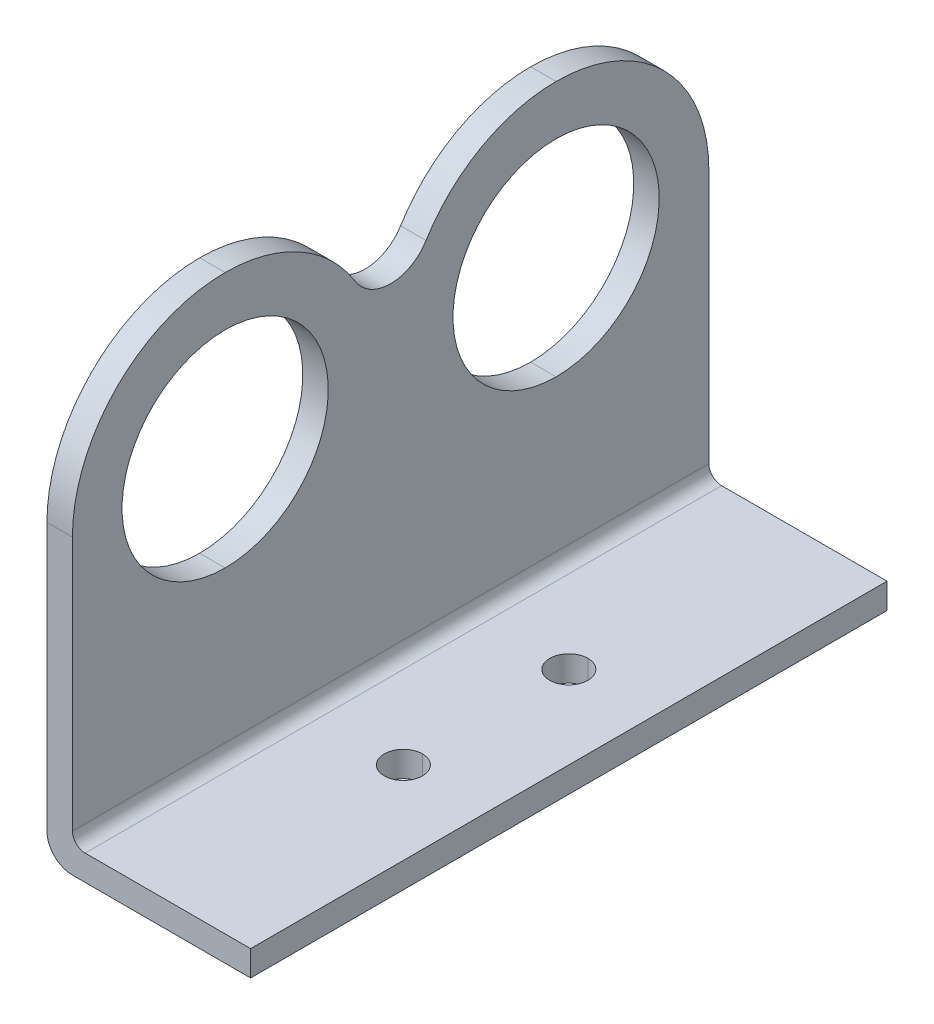
ISO-10303-21;
HEADER;
FILE_DESCRIPTION(('STEP AP214'),'2;1');
FILE_NAME('part.step','',(''),(''),'','','');
FILE_SCHEMA(('AUTOMOTIVE_DESIGN { 1 0 10303 214 1 1 1 1 }'));
ENDSEC;
DATA;
#1=APPLICATION_CONTEXT('core data for automotive mechanical design processes');
#2=APPLICATION_PROTOCOL_DEFINITION('international standard','automotive_design',2000,#1);
#3=PRODUCT_CONTEXT('',#1,'mechanical');
#4=PRODUCT('Part','Part','',(#3));
#5=PRODUCT_RELATED_PRODUCT_CATEGORY('part','',(#4));
#6=PRODUCT_DEFINITION_FORMATION('','',#4);
#7=PRODUCT_DEFINITION_CONTEXT('part definition',#1,'design');
#8=PRODUCT_DEFINITION('design','',#6,#7);
#9=PRODUCT_DEFINITION_SHAPE('','',#8);
#10=(LENGTH_UNIT() NAMED_UNIT(*) SI_UNIT(.MILLI.,.METRE.));
#11=(NAMED_UNIT(*) PLANE_ANGLE_UNIT() SI_UNIT($,.RADIAN.));
#12=(NAMED_UNIT(*) SI_UNIT($,.STERADIAN.) SOLID_ANGLE_UNIT());
#13=UNCERTAINTY_MEASURE_WITH_UNIT(LENGTH_MEASURE(1.E-05),#10,'distance_accuracy_value','');
#14=(GEOMETRIC_REPRESENTATION_CONTEXT(3) GLOBAL_UNCERTAINTY_ASSIGNED_CONTEXT((#13)) GLOBAL_UNIT_ASSIGNED_CONTEXT((#10,
#11,#12)) REPRESENTATION_CONTEXT('',''));
#15=CARTESIAN_POINT('',(0.,0.,0.));
#16=DIRECTION('',(0.,0.,1.));
#17=DIRECTION('',(1.,0.,0.));
#18=AXIS2_PLACEMENT_3D('',#15,#16,#17);
#19=CARTESIAN_POINT('',(-48.,31.,25.));
#20=DIRECTION('',(1.,0.,0.));
#21=DIRECTION('',(0.,1.,0.));
#22=AXIS2_PLACEMENT_3D('',#19,#20,#21);
#23=CYLINDRICAL_SURFACE('',#22,3.26433752247375);
#24=DIRECTION('',(1.,0.,0.));
#25=VECTOR('',#24,1.);
#26=CARTESIAN_POINT('',(-48.,29.289169107972,27.7801001995454));
#27=LINE('',#26,#25);
#28=CARTESIAN_POINT('',(0.,29.289169107972,27.7801001995454));
#29=VERTEX_POINT('',#28);
#30=CARTESIAN_POINT('',(2.,29.289169107972,27.7801001995454));
#31=VERTEX_POINT('',#30);
#32=EDGE_CURVE('E273',#29,#31,#27,.T.);
#33=ORIENTED_EDGE('',*,*,#32,.T.);
#34=CARTESIAN_POINT('',(2.,31.,25.));
#35=DIRECTION('',(1.,0.,0.));
#36=DIRECTION('',(0.,1.,0.));
#37=AXIS2_PLACEMENT_3D('',#34,#35,#36);
#38=CIRCLE('',#37,3.26433752247375);
#39=CARTESIAN_POINT('',(2.,29.289169107972,22.2198998004546));
#40=VERTEX_POINT('',#39);
#41=EDGE_CURVE('E342',#31,#40,#38,.T.);
#42=ORIENTED_EDGE('',*,*,#41,.T.);
#43=DIRECTION('',(1.,0.,0.));
#44=VECTOR('',#43,1.);
#45=CARTESIAN_POINT('',(-48.,29.289169107972,22.2198998004546));
#46=LINE('',#45,#44);
#47=CARTESIAN_POINT('',(0.,29.289169107972,22.2198998004546));
#48=VERTEX_POINT('',#47);
#49=EDGE_CURVE('E9',#48,#40,#46,.T.);
#50=ORIENTED_EDGE('',*,*,#49,.F.);
#51=CARTESIAN_POINT('',(0.,31.,25.));
#52=DIRECTION('',(1.,0.,0.));
#53=DIRECTION('',(0.,1.,0.));
#54=AXIS2_PLACEMENT_3D('',#51,#52,#53);
#55=CIRCLE('',#54,3.26433752247375);
#56=EDGE_CURVE('E285',#29,#48,#55,.T.);
#57=ORIENTED_EDGE('',*,*,#56,.F.);
#58=EDGE_LOOP('',(#33,#42,#50,#57));
#59=FACE_BOUND('',#58,.T.);
#60=ADVANCED_FACE('F15',(#59),#23,.F.);
#61=CARTESIAN_POINT('',(-48.,23.,38.));
#62=DIRECTION('',(1.,0.,0.));
#63=DIRECTION('',(0.,1.,0.));
#64=AXIS2_PLACEMENT_3D('',#61,#62,#63);
#65=CYLINDRICAL_SURFACE('',#64,8.1);
#66=DIRECTION('',(1.,0.,0.));
#67=VECTOR('',#66,1.);
#68=CARTESIAN_POINT('',(-48.,14.9,38.));
#69=LINE('',#68,#67);
#70=CARTESIAN_POINT('',(0.,14.9,38.));
#71=VERTEX_POINT('',#70);
#72=CARTESIAN_POINT('',(2.,14.9,38.));
#73=VERTEX_POINT('',#72);
#74=EDGE_CURVE('E213',#71,#73,#69,.T.);
#75=ORIENTED_EDGE('',*,*,#74,.F.);
#76=CARTESIAN_POINT('',(0.,23.,38.));
#77=DIRECTION('',(1.,0.,0.));
#78=DIRECTION('',(0.,1.,0.));
#79=AXIS2_PLACEMENT_3D('',#76,#77,#78);
#80=CIRCLE('',#79,8.1);
#81=CARTESIAN_POINT('',(0.,31.1,38.));
#82=VERTEX_POINT('',#81);
#83=EDGE_CURVE('E199',#82,#71,#80,.T.);
#84=ORIENTED_EDGE('',*,*,#83,.F.);
#85=DIRECTION('',(1.,0.,0.));
#86=VECTOR('',#85,1.);
#87=CARTESIAN_POINT('',(-48.,31.1,38.));
#88=LINE('',#87,#86);
#89=CARTESIAN_POINT('',(2.,31.1,38.));
#90=VERTEX_POINT('',#89);
#91=EDGE_CURVE('E223',#82,#90,#88,.T.);
#92=ORIENTED_EDGE('',*,*,#91,.T.);
#93=CARTESIAN_POINT('',(2.,23.,38.));
#94=DIRECTION('',(1.,0.,0.));
#95=DIRECTION('',(0.,1.,0.));
#96=AXIS2_PLACEMENT_3D('',#93,#94,#95);
#97=CIRCLE('',#96,8.1);
#98=EDGE_CURVE('E215',#90,#73,#97,.T.);
#99=ORIENTED_EDGE('',*,*,#98,.T.);
#100=EDGE_LOOP('',(#75,#84,#92,#99));
#101=FACE_BOUND('',#100,.T.);
#102=ADVANCED_FACE('F214',(#101),#65,.F.);
#103=CARTESIAN_POINT('',(-48.,23.,12.));
#104=DIRECTION('',(1.,0.,0.));
#105=DIRECTION('',(0.,1.,0.));
#106=AXIS2_PLACEMENT_3D('',#103,#104,#105);
#107=CYLINDRICAL_SURFACE('',#106,8.1);
#108=DIRECTION('',(1.,0.,0.));
#109=VECTOR('',#108,1.);
#110=CARTESIAN_POINT('',(-48.,14.9,12.));
#111=LINE('',#110,#109);
#112=CARTESIAN_POINT('',(0.,14.9,12.));
#113=VERTEX_POINT('',#112);
#114=CARTESIAN_POINT('',(2.,14.9,12.));
#115=VERTEX_POINT('',#114);
#116=EDGE_CURVE('E234',#113,#115,#111,.T.);
#117=ORIENTED_EDGE('',*,*,#116,.F.);
#118=CARTESIAN_POINT('',(0.,23.,12.));
#119=DIRECTION('',(1.,0.,0.));
#120=DIRECTION('',(0.,1.,0.));
#121=AXIS2_PLACEMENT_3D('',#118,#119,#120);
#122=CIRCLE('',#121,8.1);
#123=CARTESIAN_POINT('',(0.,31.1,12.));
#124=VERTEX_POINT('',#123);
#125=EDGE_CURVE('E209',#124,#113,#122,.T.);
#126=ORIENTED_EDGE('',*,*,#125,.F.);
#127=DIRECTION('',(1.,0.,0.));
#128=VECTOR('',#127,1.);
#129=CARTESIAN_POINT('',(-48.,31.1,12.));
#130=LINE('',#129,#128);
#131=CARTESIAN_POINT('',(2.,31.1,12.));
#132=VERTEX_POINT('',#131);
#133=EDGE_CURVE('E233',#124,#132,#130,.T.);
#134=ORIENTED_EDGE('',*,*,#133,.T.);
#135=CARTESIAN_POINT('',(2.,23.,12.));
#136=DIRECTION('',(1.,0.,0.));
#137=DIRECTION('',(0.,1.,0.));
#138=AXIS2_PLACEMENT_3D('',#135,#136,#137);
#139=CIRCLE('',#138,8.1);
#140=EDGE_CURVE('E308',#132,#115,#139,.T.);
#141=ORIENTED_EDGE('',*,*,#140,.T.);
#142=EDGE_LOOP('',(#117,#126,#134,#141));
#143=FACE_BOUND('',#142,.T.);
#144=ADVANCED_FACE('F473',(#143),#107,.F.);
#145=CARTESIAN_POINT('',(-48.,23.,38.));
#146=DIRECTION('',(1.,0.,0.));
#147=DIRECTION('',(0.,1.,0.));
#148=AXIS2_PLACEMENT_3D('',#145,#146,#147);
#149=CYLINDRICAL_SURFACE('',#148,12.);
#150=DIRECTION('',(1.,0.,0.));
#151=VECTOR('',#150,1.);
#152=CARTESIAN_POINT('',(-48.,35.,38.));
#153=LINE('',#152,#151);
#154=CARTESIAN_POINT('',(0.,35.,38.));
#155=VERTEX_POINT('',#154);
#156=CARTESIAN_POINT('',(2.,35.,38.));
#157=VERTEX_POINT('',#156);
#158=EDGE_CURVE('E265',#155,#157,#153,.T.);
#159=ORIENTED_EDGE('',*,*,#158,.F.);
#160=CARTESIAN_POINT('',(0.,23.,38.));
#161=DIRECTION('',(1.,0.,0.));
#162=DIRECTION('',(0.,1.,0.));
#163=AXIS2_PLACEMENT_3D('',#160,#161,#162);
#164=CIRCLE('',#163,12.);
#165=CARTESIAN_POINT('',(0.,23.,50.));
#166=VERTEX_POINT('',#165);
#167=EDGE_CURVE('E210',#155,#166,#164,.T.);
#168=ORIENTED_EDGE('',*,*,#167,.T.);
#169=DIRECTION('',(1.,0.,0.));
#170=VECTOR('',#169,1.);
#171=CARTESIAN_POINT('',(-48.,23.,50.));
#172=LINE('',#171,#170);
#173=CARTESIAN_POINT('',(2.,23.,50.));
#174=VERTEX_POINT('',#173);
#175=EDGE_CURVE('E23',#166,#174,#172,.T.);
#176=ORIENTED_EDGE('',*,*,#175,.T.);
#177=CARTESIAN_POINT('',(2.,23.,38.));
#178=DIRECTION('',(1.,0.,0.));
#179=DIRECTION('',(0.,1.,0.));
#180=AXIS2_PLACEMENT_3D('',#177,#178,#179);
#181=CIRCLE('',#180,12.);
#182=EDGE_CURVE('E352',#157,#174,#181,.T.);
#183=ORIENTED_EDGE('',*,*,#182,.F.);
#184=EDGE_LOOP('',(#159,#168,#176,#183));
#185=FACE_BOUND('',#184,.T.);
#186=ADVANCED_FACE('F432',(#185),#149,.T.);
#187=CARTESIAN_POINT('',(-48.,23.,12.));
#188=DIRECTION('',(1.,0.,0.));
#189=DIRECTION('',(0.,1.,0.));
#190=AXIS2_PLACEMENT_3D('',#187,#188,#189);
#191=CYLINDRICAL_SURFACE('',#190,12.);
#192=DIRECTION('',(1.,0.,0.));
#193=VECTOR('',#192,1.);
#194=CARTESIAN_POINT('',(-48.,35.,12.));
#195=LINE('',#194,#193);
#196=CARTESIAN_POINT('',(0.,35.,12.));
#197=VERTEX_POINT('',#196);
#198=CARTESIAN_POINT('',(2.,35.,12.));
#199=VERTEX_POINT('',#198);
#200=EDGE_CURVE('E277',#197,#199,#195,.T.);
#201=ORIENTED_EDGE('',*,*,#200,.F.);
#202=CARTESIAN_POINT('',(0.,23.,12.));
#203=DIRECTION('',(1.,0.,0.));
#204=DIRECTION('',(0.,1.,0.));
#205=AXIS2_PLACEMENT_3D('',#202,#203,#204);
#206=CIRCLE('',#205,12.);
#207=EDGE_CURVE('E289',#197,#48,#206,.T.);
#208=ORIENTED_EDGE('',*,*,#207,.T.);
#209=ORIENTED_EDGE('',*,*,#49,.T.);
#210=CARTESIAN_POINT('',(2.,23.,12.));
#211=DIRECTION('',(1.,0.,0.));
#212=DIRECTION('',(0.,1.,0.));
#213=AXIS2_PLACEMENT_3D('',#210,#211,#212);
#214=CIRCLE('',#213,12.);
#215=EDGE_CURVE('E309',#199,#40,#214,.T.);
#216=ORIENTED_EDGE('',*,*,#215,.F.);
#217=EDGE_LOOP('',(#201,#208,#209,#216));
#218=FACE_BOUND('',#217,.T.);
#219=ADVANCED_FACE('F466',(#218),#191,.T.);
#220=CARTESIAN_POINT('',(9.5,-48.,18.5));
#221=DIRECTION('',(0.,1.,0.));
#222=DIRECTION('',(0.,0.,1.));
#223=AXIS2_PLACEMENT_3D('',#220,#221,#222);
#224=CYLINDRICAL_SURFACE('',#223,1.5);
#225=DIRECTION('',(0.,1.,0.));
#226=VECTOR('',#225,1.);
#227=CARTESIAN_POINT('',(9.5,-48.,17.));
#228=LINE('',#227,#226);
#229=CARTESIAN_POINT('',(9.5,0.,17.));
#230=VERTEX_POINT('',#229);
#231=CARTESIAN_POINT('',(9.5,2.,17.));
#232=VERTEX_POINT('',#231);
#233=EDGE_CURVE('E297',#230,#232,#228,.T.);
#234=ORIENTED_EDGE('',*,*,#233,.F.);
#235=CARTESIAN_POINT('',(9.5,0.,18.5));
#236=DIRECTION('',(0.,1.,0.));
#237=DIRECTION('',(0.,0.,1.));
#238=AXIS2_PLACEMENT_3D('',#235,#236,#237);
#239=CIRCLE('',#238,1.5);
#240=CARTESIAN_POINT('',(9.5,0.,20.));
#241=VERTEX_POINT('',#240);
#242=EDGE_CURVE('E390',#241,#230,#239,.T.);
#243=ORIENTED_EDGE('',*,*,#242,.F.);
#244=DIRECTION('',(0.,1.,0.));
#245=VECTOR('',#244,1.);
#246=CARTESIAN_POINT('',(9.5,-48.,20.));
#247=LINE('',#246,#245);
#248=CARTESIAN_POINT('',(9.5,2.,20.));
#249=VERTEX_POINT('',#248);
#250=EDGE_CURVE('E305',#241,#249,#247,.T.);
#251=ORIENTED_EDGE('',*,*,#250,.T.);
#252=CARTESIAN_POINT('',(9.5,2.,18.5));
#253=DIRECTION('',(0.,1.,0.));
#254=DIRECTION('',(0.,0.,1.));
#255=AXIS2_PLACEMENT_3D('',#252,#253,#254);
#256=CIRCLE('',#255,1.5);
#257=EDGE_CURVE('E418',#249,#232,#256,.T.);
#258=ORIENTED_EDGE('',*,*,#257,.T.);
#259=EDGE_LOOP('',(#234,#243,#251,#258));
#260=FACE_BOUND('',#259,.T.);
#261=ADVANCED_FACE('F482',(#260),#224,.F.);
#262=CARTESIAN_POINT('',(9.5,-48.,31.5));
#263=DIRECTION('',(0.,1.,0.));
#264=DIRECTION('',(0.,0.,1.));
#265=AXIS2_PLACEMENT_3D('',#262,#263,#264);
#266=CYLINDRICAL_SURFACE('',#265,1.5);
#267=DIRECTION('',(0.,1.,0.));
#268=VECTOR('',#267,1.);
#269=CARTESIAN_POINT('',(9.5,-48.,30.));
#270=LINE('',#269,#268);
#271=CARTESIAN_POINT('',(9.5,0.,30.));
#272=VERTEX_POINT('',#271);
#273=CARTESIAN_POINT('',(9.5,2.,30.));
#274=VERTEX_POINT('',#273);
#275=EDGE_CURVE('E317',#272,#274,#270,.T.);
#276=ORIENTED_EDGE('',*,*,#275,.F.);
#277=CARTESIAN_POINT('',(9.5,0.,31.5));
#278=DIRECTION('',(0.,1.,0.));
#279=DIRECTION('',(0.,0.,1.));
#280=AXIS2_PLACEMENT_3D('',#277,#278,#279);
#281=CIRCLE('',#280,1.5);
#282=CARTESIAN_POINT('',(9.5,0.,33.));
#283=VERTEX_POINT('',#282);
#284=EDGE_CURVE('E393',#283,#272,#281,.T.);
#285=ORIENTED_EDGE('',*,*,#284,.F.);
#286=DIRECTION('',(0.,1.,0.));
#287=VECTOR('',#286,1.);
#288=CARTESIAN_POINT('',(9.5,-48.,33.));
#289=LINE('',#288,#287);
#290=CARTESIAN_POINT('',(9.5,2.,33.));
#291=VERTEX_POINT('',#290);
#292=EDGE_CURVE('E290',#283,#291,#289,.T.);
#293=ORIENTED_EDGE('',*,*,#292,.T.);
#294=CARTESIAN_POINT('',(9.5,2.,31.5));
#295=DIRECTION('',(0.,1.,0.));
#296=DIRECTION('',(0.,0.,1.));
#297=AXIS2_PLACEMENT_3D('',#294,#295,#296);
#298=CIRCLE('',#297,1.5);
#299=EDGE_CURVE('E421',#291,#274,#298,.T.);
#300=ORIENTED_EDGE('',*,*,#299,.T.);
#301=EDGE_LOOP('',(#276,#285,#293,#300));
#302=FACE_BOUND('',#301,.T.);
#303=ADVANCED_FACE('F485',(#302),#266,.F.);
#304=CARTESIAN_POINT('',(2.,2.,0.));
#305=DIRECTION('',(0.,0.,1.));
#306=DIRECTION('',(1.,0.,0.));
#307=AXIS2_PLACEMENT_3D('',#304,#305,#306);
#308=PLANE('',#307);
#309=DIRECTION('',(0.,-1.,0.));
#310=VECTOR('',#309,1.);
#311=CARTESIAN_POINT('',(0.,35.,0.));
#312=LINE('',#311,#310);
#313=CARTESIAN_POINT('',(0.,23.,0.));
#314=VERTEX_POINT('',#313);
#315=CARTESIAN_POINT('',(0.,2.,0.));
#316=VERTEX_POINT('',#315);
#317=EDGE_CURVE('E331',#314,#316,#312,.T.);
#318=ORIENTED_EDGE('',*,*,#317,.F.);
#319=DIRECTION('',(1.,0.,0.));
#320=VECTOR('',#319,1.);
#321=CARTESIAN_POINT('',(-48.,23.,0.));
#322=LINE('',#321,#320);
#323=CARTESIAN_POINT('',(2.,23.,0.));
#324=VERTEX_POINT('',#323);
#325=EDGE_CURVE('E252',#314,#324,#322,.T.);
#326=ORIENTED_EDGE('',*,*,#325,.T.);
#327=DIRECTION('',(0.,1.,0.));
#328=VECTOR('',#327,1.);
#329=CARTESIAN_POINT('',(2.,3.,0.));
#330=LINE('',#329,#328);
#331=CARTESIAN_POINT('',(2.,3.,0.));
#332=VERTEX_POINT('',#331);
#333=EDGE_CURVE('E244',#332,#324,#330,.T.);
#334=ORIENTED_EDGE('',*,*,#333,.F.);
#335=CARTESIAN_POINT('',(3.,3.,0.));
#336=DIRECTION('',(0.,0.,-1.));
#337=DIRECTION('',(1.,0.,0.));
#338=AXIS2_PLACEMENT_3D('',#335,#336,#337);
#339=CIRCLE('',#338,1.);
#340=CARTESIAN_POINT('',(3.,2.,0.));
#341=VERTEX_POINT('',#340);
#342=EDGE_CURVE('E47',#341,#332,#339,.T.);
#343=ORIENTED_EDGE('',*,*,#342,.F.);
#344=DIRECTION('',(-1.,0.,0.));
#345=VECTOR('',#344,1.);
#346=CARTESIAN_POINT('',(16.,2.,0.));
#347=LINE('',#346,#345);
#348=CARTESIAN_POINT('',(16.,2.,0.));
#349=VERTEX_POINT('',#348);
#350=EDGE_CURVE('E408',#349,#341,#347,.T.);
#351=ORIENTED_EDGE('',*,*,#350,.F.);
#352=DIRECTION('',(0.,1.,0.));
#353=VECTOR('',#352,1.);
#354=CARTESIAN_POINT('',(16.,0.,0.));
#355=LINE('',#354,#353);
#356=CARTESIAN_POINT('',(16.,0.,0.));
#357=VERTEX_POINT('',#356);
#358=EDGE_CURVE('E396',#357,#349,#355,.T.);
#359=ORIENTED_EDGE('',*,*,#358,.F.);
#360=DIRECTION('',(1.,0.,0.));
#361=VECTOR('',#360,1.);
#362=CARTESIAN_POINT('',(2.,0.,0.));
#363=LINE('',#362,#361);
#364=CARTESIAN_POINT('',(2.,0.,0.));
#365=VERTEX_POINT('',#364);
#366=EDGE_CURVE('E378',#365,#357,#363,.T.);
#367=ORIENTED_EDGE('',*,*,#366,.F.);
#368=CARTESIAN_POINT('',(2.,2.,0.));
#369=DIRECTION('',(0.,0.,1.));
#370=DIRECTION('',(1.,0.,0.));
#371=AXIS2_PLACEMENT_3D('',#368,#369,#370);
#372=CIRCLE('',#371,2.);
#373=EDGE_CURVE('E366',#316,#365,#372,.T.);
#374=ORIENTED_EDGE('',*,*,#373,.F.);
#375=EDGE_LOOP('',(#318,#326,#334,#343,#351,#359,#367,#374));
#376=FACE_BOUND('',#375,.T.);
#377=ADVANCED_FACE('F458',(#376),#308,.F.);
#378=CARTESIAN_POINT('',(2.,2.,50.));
#379=DIRECTION('',(0.,0.,1.));
#380=DIRECTION('',(1.,0.,0.));
#381=AXIS2_PLACEMENT_3D('',#378,#379,#380);
#382=PLANE('',#381);
#383=ORIENTED_EDGE('',*,*,#175,.F.);
#384=DIRECTION('',(0.,-1.,0.));
#385=VECTOR('',#384,1.);
#386=CARTESIAN_POINT('',(0.,35.,50.));
#387=LINE('',#386,#385);
#388=CARTESIAN_POINT('',(0.,2.,50.));
#389=VERTEX_POINT('',#388);
#390=EDGE_CURVE('E339',#166,#389,#387,.T.);
#391=ORIENTED_EDGE('',*,*,#390,.T.);
#392=CARTESIAN_POINT('',(2.,2.,50.));
#393=DIRECTION('',(0.,0.,1.));
#394=DIRECTION('',(1.,0.,0.));
#395=AXIS2_PLACEMENT_3D('',#392,#393,#394);
#396=CIRCLE('',#395,2.);
#397=CARTESIAN_POINT('',(2.,0.,50.));
#398=VERTEX_POINT('',#397);
#399=EDGE_CURVE('E374',#389,#398,#396,.T.);
#400=ORIENTED_EDGE('',*,*,#399,.T.);
#401=DIRECTION('',(1.,0.,0.));
#402=VECTOR('',#401,1.);
#403=CARTESIAN_POINT('',(2.,0.,50.));
#404=LINE('',#403,#402);
#405=CARTESIAN_POINT('',(16.,0.,50.));
#406=VERTEX_POINT('',#405);
#407=EDGE_CURVE('E386',#398,#406,#404,.T.);
#408=ORIENTED_EDGE('',*,*,#407,.T.);
#409=DIRECTION('',(0.,1.,0.));
#410=VECTOR('',#409,1.);
#411=CARTESIAN_POINT('',(16.,0.,50.));
#412=LINE('',#411,#410);
#413=CARTESIAN_POINT('',(16.,2.,50.));
#414=VERTEX_POINT('',#413);
#415=EDGE_CURVE('E404',#406,#414,#412,.T.);
#416=ORIENTED_EDGE('',*,*,#415,.T.);
#417=DIRECTION('',(-1.,0.,0.));
#418=VECTOR('',#417,1.);
#419=CARTESIAN_POINT('',(16.,2.,50.));
#420=LINE('',#419,#418);
#421=CARTESIAN_POINT('',(3.,2.,50.));
#422=VERTEX_POINT('',#421);
#423=EDGE_CURVE('E415',#414,#422,#420,.T.);
#424=ORIENTED_EDGE('',*,*,#423,.T.);
#425=CARTESIAN_POINT('',(3.,3.,50.));
#426=DIRECTION('',(0.,0.,-1.));
#427=DIRECTION('',(1.,0.,0.));
#428=AXIS2_PLACEMENT_3D('',#425,#426,#427);
#429=CIRCLE('',#428,1.);
#430=CARTESIAN_POINT('',(2.,3.,50.));
#431=VERTEX_POINT('',#430);
#432=EDGE_CURVE('E36',#422,#431,#429,.T.);
#433=ORIENTED_EDGE('',*,*,#432,.T.);
#434=DIRECTION('',(0.,1.,0.));
#435=VECTOR('',#434,1.);
#436=CARTESIAN_POINT('',(2.,3.,50.));
#437=LINE('',#436,#435);
#438=EDGE_CURVE('E245',#431,#174,#437,.T.);
#439=ORIENTED_EDGE('',*,*,#438,.T.);
#440=EDGE_LOOP('',(#383,#391,#400,#408,#416,#424,#433,#439));
#441=FACE_BOUND('',#440,.T.);
#442=ADVANCED_FACE('F436',(#441),#382,.T.);
#443=CARTESIAN_POINT('',(3.,3.,50.));
#444=DIRECTION('',(0.,0.,-1.));
#445=DIRECTION('',(-1.,0.,0.));
#446=AXIS2_PLACEMENT_3D('',#443,#444,#445);
#447=CYLINDRICAL_SURFACE('',#446,1.);
#448=ORIENTED_EDGE('',*,*,#342,.T.);
#449=DIRECTION('',(0.,0.,-1.));
#450=VECTOR('',#449,1.);
#451=CARTESIAN_POINT('',(2.,3.,50.));
#452=LINE('',#451,#450);
#453=EDGE_CURVE('E240',#431,#332,#452,.T.);
#454=ORIENTED_EDGE('',*,*,#453,.F.);
#455=ORIENTED_EDGE('',*,*,#432,.F.);
#456=DIRECTION('',(0.,0.,-1.));
#457=VECTOR('',#456,1.);
#458=CARTESIAN_POINT('',(3.,2.,50.));
#459=LINE('',#458,#457);
#460=EDGE_CURVE('E412',#422,#341,#459,.T.);
#461=ORIENTED_EDGE('',*,*,#460,.T.);
#462=EDGE_LOOP('',(#448,#454,#455,#461));
#463=FACE_BOUND('',#462,.T.);
#464=ADVANCED_FACE('F457',(#463),#447,.F.);
#465=CARTESIAN_POINT('',(16.,2.,50.));
#466=DIRECTION('',(0.,-1.,0.));
#467=DIRECTION('',(0.,0.,-1.));
#468=AXIS2_PLACEMENT_3D('',#465,#466,#467);
#469=PLANE('',#468);
#470=ORIENTED_EDGE('',*,*,#299,.F.);
#471=CARTESIAN_POINT('',(9.5,2.,31.5));
#472=DIRECTION('',(0.,1.,0.));
#473=DIRECTION('',(0.,0.,1.));
#474=AXIS2_PLACEMENT_3D('',#471,#472,#473);
#475=CIRCLE('',#474,1.5);
#476=EDGE_CURVE('E321',#274,#291,#475,.T.);
#477=ORIENTED_EDGE('',*,*,#476,.F.);
#478=EDGE_LOOP('',(#470,#477));
#479=FACE_BOUND('',#478,.T.);
#480=ORIENTED_EDGE('',*,*,#257,.F.);
#481=CARTESIAN_POINT('',(9.5,2.,18.5));
#482=DIRECTION('',(0.,1.,0.));
#483=DIRECTION('',(0.,0.,1.));
#484=AXIS2_PLACEMENT_3D('',#481,#482,#483);
#485=CIRCLE('',#484,1.5);
#486=EDGE_CURVE('E301',#232,#249,#485,.T.);
#487=ORIENTED_EDGE('',*,*,#486,.F.);
#488=EDGE_LOOP('',(#480,#487));
#489=FACE_BOUND('',#488,.T.);
#490=ORIENTED_EDGE('',*,*,#350,.T.);
#491=ORIENTED_EDGE('',*,*,#460,.F.);
#492=ORIENTED_EDGE('',*,*,#423,.F.);
#493=DIRECTION('',(0.,0.,-1.));
#494=VECTOR('',#493,1.);
#495=CARTESIAN_POINT('',(16.,2.,50.));
#496=LINE('',#495,#494);
#497=EDGE_CURVE('E400',#414,#349,#496,.T.);
#498=ORIENTED_EDGE('',*,*,#497,.T.);
#499=EDGE_LOOP('',(#490,#491,#492,#498));
#500=FACE_BOUND('',#499,.T.);
#501=ADVANCED_FACE('F456',(#479,#489,#500),#469,.F.);
#502=CARTESIAN_POINT('',(16.,0.,50.));
#503=DIRECTION('',(-1.,0.,0.));
#504=DIRECTION('',(0.,1.,0.));
#505=AXIS2_PLACEMENT_3D('',#502,#503,#504);
#506=PLANE('',#505);
#507=ORIENTED_EDGE('',*,*,#358,.T.);
#508=ORIENTED_EDGE('',*,*,#497,.F.);
#509=ORIENTED_EDGE('',*,*,#415,.F.);
#510=DIRECTION('',(0.,0.,-1.));
#511=VECTOR('',#510,1.);
#512=CARTESIAN_POINT('',(16.,0.,50.));
#513=LINE('',#512,#511);
#514=EDGE_CURVE('E382',#406,#357,#513,.T.);
#515=ORIENTED_EDGE('',*,*,#514,.T.);
#516=EDGE_LOOP('',(#507,#508,#509,#515));
#517=FACE_BOUND('',#516,.T.);
#518=ADVANCED_FACE('F452',(#517),#506,.F.);
#519=CARTESIAN_POINT('',(2.,0.,50.));
#520=DIRECTION('',(0.,1.,0.));
#521=DIRECTION('',(1.,0.,0.));
#522=AXIS2_PLACEMENT_3D('',#519,#520,#521);
#523=PLANE('',#522);
#524=ORIENTED_EDGE('',*,*,#284,.T.);
#525=CARTESIAN_POINT('',(9.5,0.,31.5));
#526=DIRECTION('',(0.,1.,0.));
#527=DIRECTION('',(0.,0.,1.));
#528=AXIS2_PLACEMENT_3D('',#525,#526,#527);
#529=CIRCLE('',#528,1.5);
#530=EDGE_CURVE('E313',#272,#283,#529,.T.);
#531=ORIENTED_EDGE('',*,*,#530,.T.);
#532=EDGE_LOOP('',(#524,#531));
#533=FACE_BOUND('',#532,.T.);
#534=ORIENTED_EDGE('',*,*,#242,.T.);
#535=CARTESIAN_POINT('',(9.5,0.,18.5));
#536=DIRECTION('',(0.,1.,0.));
#537=DIRECTION('',(0.,0.,1.));
#538=AXIS2_PLACEMENT_3D('',#535,#536,#537);
#539=CIRCLE('',#538,1.5);
#540=EDGE_CURVE('E256',#230,#241,#539,.T.);
#541=ORIENTED_EDGE('',*,*,#540,.T.);
#542=EDGE_LOOP('',(#534,#541));
#543=FACE_BOUND('',#542,.T.);
#544=ORIENTED_EDGE('',*,*,#366,.T.);
#545=ORIENTED_EDGE('',*,*,#514,.F.);
#546=ORIENTED_EDGE('',*,*,#407,.F.);
#547=DIRECTION('',(0.,0.,-1.));
#548=VECTOR('',#547,1.);
#549=CARTESIAN_POINT('',(2.,0.,50.));
#550=LINE('',#549,#548);
#551=EDGE_CURVE('E370',#398,#365,#550,.T.);
#552=ORIENTED_EDGE('',*,*,#551,.T.);
#553=EDGE_LOOP('',(#544,#545,#546,#552));
#554=FACE_BOUND('',#553,.T.);
#555=ADVANCED_FACE('F450',(#533,#543,#554),#523,.F.);
#556=CARTESIAN_POINT('',(2.,2.,50.));
#557=DIRECTION('',(0.,0.,-1.));
#558=DIRECTION('',(-1.,0.,0.));
#559=AXIS2_PLACEMENT_3D('',#556,#557,#558);
#560=CYLINDRICAL_SURFACE('',#559,2.);
#561=ORIENTED_EDGE('',*,*,#373,.T.);
#562=ORIENTED_EDGE('',*,*,#551,.F.);
#563=ORIENTED_EDGE('',*,*,#399,.F.);
#564=DIRECTION('',(0.,0.,-1.));
#565=VECTOR('',#564,1.);
#566=CARTESIAN_POINT('',(0.,2.,50.));
#567=LINE('',#566,#565);
#568=EDGE_CURVE('E335',#389,#316,#567,.T.);
#569=ORIENTED_EDGE('',*,*,#568,.T.);
#570=EDGE_LOOP('',(#561,#562,#563,#569));
#571=FACE_BOUND('',#570,.T.);
#572=ADVANCED_FACE('F448',(#571),#560,.T.);
#573=CARTESIAN_POINT('',(2.,3.,50.));
#574=DIRECTION('',(-1.,0.,0.));
#575=DIRECTION('',(0.,0.,1.));
#576=AXIS2_PLACEMENT_3D('',#573,#574,#575);
#577=PLANE('',#576);
#578=ORIENTED_EDGE('',*,*,#140,.F.);
#579=CARTESIAN_POINT('',(2.,23.,12.));
#580=DIRECTION('',(1.,0.,0.));
#581=DIRECTION('',(0.,1.,0.));
#582=AXIS2_PLACEMENT_3D('',#579,#580,#581);
#583=CIRCLE('',#582,8.1);
#584=EDGE_CURVE('E229',#115,#132,#583,.T.);
#585=ORIENTED_EDGE('',*,*,#584,.F.);
#586=EDGE_LOOP('',(#578,#585));
#587=FACE_BOUND('',#586,.T.);
#588=ORIENTED_EDGE('',*,*,#98,.F.);
#589=CARTESIAN_POINT('',(2.,23.,38.));
#590=DIRECTION('',(1.,0.,0.));
#591=DIRECTION('',(0.,1.,0.));
#592=AXIS2_PLACEMENT_3D('',#589,#590,#591);
#593=CIRCLE('',#592,8.1);
#594=EDGE_CURVE('E220',#73,#90,#593,.T.);
#595=ORIENTED_EDGE('',*,*,#594,.F.);
#596=EDGE_LOOP('',(#588,#595));
#597=FACE_BOUND('',#596,.T.);
#598=ORIENTED_EDGE('',*,*,#41,.F.);
#599=CARTESIAN_POINT('',(2.,23.,38.));
#600=DIRECTION('',(1.,0.,0.));
#601=DIRECTION('',(0.,1.,0.));
#602=AXIS2_PLACEMENT_3D('',#599,#600,#601);
#603=CIRCLE('',#602,12.);
#604=EDGE_CURVE('E269',#31,#157,#603,.T.);
#605=ORIENTED_EDGE('',*,*,#604,.T.);
#606=ORIENTED_EDGE('',*,*,#182,.T.);
#607=ORIENTED_EDGE('',*,*,#438,.F.);
#608=ORIENTED_EDGE('',*,*,#453,.T.);
#609=ORIENTED_EDGE('',*,*,#333,.T.);
#610=CARTESIAN_POINT('',(2.,23.,12.));
#611=DIRECTION('',(1.,0.,0.));
#612=DIRECTION('',(0.,1.,0.));
#613=AXIS2_PLACEMENT_3D('',#610,#611,#612);
#614=CIRCLE('',#613,12.);
#615=EDGE_CURVE('E257',#324,#199,#614,.T.);
#616=ORIENTED_EDGE('',*,*,#615,.T.);
#617=ORIENTED_EDGE('',*,*,#215,.T.);
#618=EDGE_LOOP('',(#598,#605,#606,#607,#608,#609,#616,#617));
#619=FACE_BOUND('',#618,.T.);
#620=ADVANCED_FACE('F438',(#587,#597,#619),#577,.F.);
#621=CARTESIAN_POINT('',(0.,35.,50.));
#622=DIRECTION('',(1.,0.,0.));
#623=DIRECTION('',(0.,-1.,0.));
#624=AXIS2_PLACEMENT_3D('',#621,#622,#623);
#625=PLANE('',#624);
#626=ORIENTED_EDGE('',*,*,#125,.T.);
#627=CARTESIAN_POINT('',(0.,23.,12.));
#628=DIRECTION('',(1.,0.,0.));
#629=DIRECTION('',(0.,1.,0.));
#630=AXIS2_PLACEMENT_3D('',#627,#628,#629);
#631=CIRCLE('',#630,8.1);
#632=EDGE_CURVE('E239',#113,#124,#631,.T.);
#633=ORIENTED_EDGE('',*,*,#632,.T.);
#634=EDGE_LOOP('',(#626,#633));
#635=FACE_BOUND('',#634,.T.);
#636=ORIENTED_EDGE('',*,*,#83,.T.);
#637=CARTESIAN_POINT('',(0.,23.,38.));
#638=DIRECTION('',(1.,0.,0.));
#639=DIRECTION('',(0.,1.,0.));
#640=AXIS2_PLACEMENT_3D('',#637,#638,#639);
#641=CIRCLE('',#640,8.1);
#642=EDGE_CURVE('E204',#71,#82,#641,.T.);
#643=ORIENTED_EDGE('',*,*,#642,.T.);
#644=EDGE_LOOP('',(#636,#643));
#645=FACE_BOUND('',#644,.T.);
#646=CARTESIAN_POINT('',(0.,23.,38.));
#647=DIRECTION('',(1.,0.,0.));
#648=DIRECTION('',(0.,1.,0.));
#649=AXIS2_PLACEMENT_3D('',#646,#647,#648);
#650=CIRCLE('',#649,12.);
#651=EDGE_CURVE('E261',#29,#155,#650,.T.);
#652=ORIENTED_EDGE('',*,*,#651,.F.);
#653=ORIENTED_EDGE('',*,*,#56,.T.);
#654=ORIENTED_EDGE('',*,*,#207,.F.);
#655=CARTESIAN_POINT('',(0.,23.,12.));
#656=DIRECTION('',(1.,0.,0.));
#657=DIRECTION('',(0.,1.,0.));
#658=AXIS2_PLACEMENT_3D('',#655,#656,#657);
#659=CIRCLE('',#658,12.);
#660=EDGE_CURVE('E281',#314,#197,#659,.T.);
#661=ORIENTED_EDGE('',*,*,#660,.F.);
#662=ORIENTED_EDGE('',*,*,#317,.T.);
#663=ORIENTED_EDGE('',*,*,#568,.F.);
#664=ORIENTED_EDGE('',*,*,#390,.F.);
#665=ORIENTED_EDGE('',*,*,#167,.F.);
#666=EDGE_LOOP('',(#652,#653,#654,#661,#662,#663,#664,#665));
#667=FACE_BOUND('',#666,.T.);
#668=ADVANCED_FACE('F201',(#635,#645,#667),#625,.F.);
#669=CARTESIAN_POINT('',(9.5,-48.,31.5));
#670=DIRECTION('',(0.,1.,0.));
#671=DIRECTION('',(0.,0.,1.));
#672=AXIS2_PLACEMENT_3D('',#669,#670,#671);
#673=CYLINDRICAL_SURFACE('',#672,1.5);
#674=ORIENTED_EDGE('',*,*,#530,.F.);
#675=ORIENTED_EDGE('',*,*,#275,.T.);
#676=ORIENTED_EDGE('',*,*,#476,.T.);
#677=ORIENTED_EDGE('',*,*,#292,.F.);
#678=EDGE_LOOP('',(#674,#675,#676,#677));
#679=FACE_BOUND('',#678,.T.);
#680=ADVANCED_FACE('F511',(#679),#673,.F.);
#681=CARTESIAN_POINT('',(9.5,-48.,18.5));
#682=DIRECTION('',(0.,1.,0.));
#683=DIRECTION('',(0.,0.,1.));
#684=AXIS2_PLACEMENT_3D('',#681,#682,#683);
#685=CYLINDRICAL_SURFACE('',#684,1.5);
#686=ORIENTED_EDGE('',*,*,#540,.F.);
#687=ORIENTED_EDGE('',*,*,#233,.T.);
#688=ORIENTED_EDGE('',*,*,#486,.T.);
#689=ORIENTED_EDGE('',*,*,#250,.F.);
#690=EDGE_LOOP('',(#686,#687,#688,#689));
#691=FACE_BOUND('',#690,.T.);
#692=ADVANCED_FACE('F514',(#691),#685,.F.);
#693=CARTESIAN_POINT('',(-48.,23.,12.));
#694=DIRECTION('',(1.,0.,0.));
#695=DIRECTION('',(0.,1.,0.));
#696=AXIS2_PLACEMENT_3D('',#693,#694,#695);
#697=CYLINDRICAL_SURFACE('',#696,12.);
#698=ORIENTED_EDGE('',*,*,#660,.T.);
#699=ORIENTED_EDGE('',*,*,#200,.T.);
#700=ORIENTED_EDGE('',*,*,#615,.F.);
#701=ORIENTED_EDGE('',*,*,#325,.F.);
#702=EDGE_LOOP('',(#698,#699,#700,#701));
#703=FACE_BOUND('',#702,.T.);
#704=ADVANCED_FACE('F463',(#703),#697,.T.);
#705=CARTESIAN_POINT('',(-48.,23.,38.));
#706=DIRECTION('',(1.,0.,0.));
#707=DIRECTION('',(0.,1.,0.));
#708=AXIS2_PLACEMENT_3D('',#705,#706,#707);
#709=CYLINDRICAL_SURFACE('',#708,12.);
#710=ORIENTED_EDGE('',*,*,#651,.T.);
#711=ORIENTED_EDGE('',*,*,#158,.T.);
#712=ORIENTED_EDGE('',*,*,#604,.F.);
#713=ORIENTED_EDGE('',*,*,#32,.F.);
#714=EDGE_LOOP('',(#710,#711,#712,#713));
#715=FACE_BOUND('',#714,.T.);
#716=ADVANCED_FACE('F442',(#715),#709,.T.);
#717=CARTESIAN_POINT('',(-48.,23.,12.));
#718=DIRECTION('',(1.,0.,0.));
#719=DIRECTION('',(0.,1.,0.));
#720=AXIS2_PLACEMENT_3D('',#717,#718,#719);
#721=CYLINDRICAL_SURFACE('',#720,8.1);
#722=ORIENTED_EDGE('',*,*,#632,.F.);
#723=ORIENTED_EDGE('',*,*,#116,.T.);
#724=ORIENTED_EDGE('',*,*,#584,.T.);
#725=ORIENTED_EDGE('',*,*,#133,.F.);
#726=EDGE_LOOP('',(#722,#723,#724,#725));
#727=FACE_BOUND('',#726,.T.);
#728=ADVANCED_FACE('F521',(#727),#721,.F.);
#729=CARTESIAN_POINT('',(-48.,23.,38.));
#730=DIRECTION('',(1.,0.,0.));
#731=DIRECTION('',(0.,1.,0.));
#732=AXIS2_PLACEMENT_3D('',#729,#730,#731);
#733=CYLINDRICAL_SURFACE('',#732,8.1);
#734=ORIENTED_EDGE('',*,*,#642,.F.);
#735=ORIENTED_EDGE('',*,*,#74,.T.);
#736=ORIENTED_EDGE('',*,*,#594,.T.);
#737=ORIENTED_EDGE('',*,*,#91,.F.);
#738=EDGE_LOOP('',(#734,#735,#736,#737));
#739=FACE_BOUND('',#738,.T.);
#740=ADVANCED_FACE('F222',(#739),#733,.F.);
#741=CLOSED_SHELL('',(#60,#102,#144,#186,#219,#261,#303,#377,#442,#464,#501,#518,#555,#572,#620,
#668,#680,#692,#704,#716,#728,#740));
#742=MANIFOLD_SOLID_BREP('B1',#741);
#743=ADVANCED_BREP_SHAPE_REPRESENTATION('',(#18,#742),#14);
#744=SHAPE_DEFINITION_REPRESENTATION(#9,#743);
ENDSEC;
END-ISO-10303-21;
